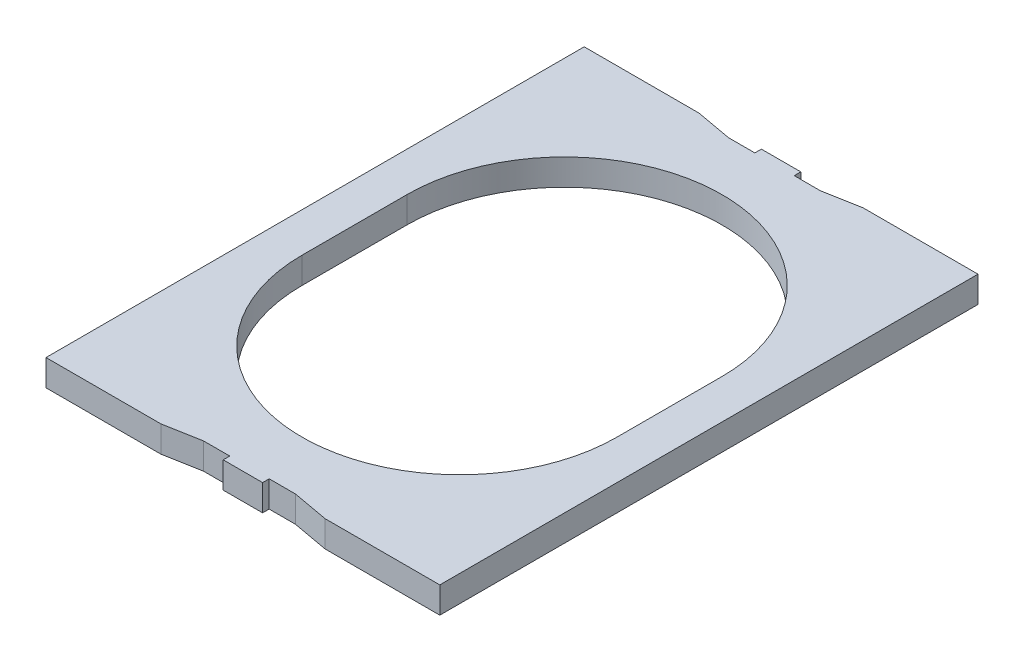
ISO-10303-21;
HEADER;
FILE_DESCRIPTION(('STEP AP214'),'2;1');
FILE_NAME('part.step','',(''),(''),'','','');
FILE_SCHEMA(('AUTOMOTIVE_DESIGN { 1 0 10303 214 1 1 1 1 }'));
ENDSEC;
DATA;
#1=APPLICATION_CONTEXT('core data for automotive mechanical design processes');
#2=APPLICATION_PROTOCOL_DEFINITION('international standard','automotive_design',2000,#1);
#3=PRODUCT_CONTEXT('',#1,'mechanical');
#4=PRODUCT('Part','Part','',(#3));
#5=PRODUCT_RELATED_PRODUCT_CATEGORY('part','',(#4));
#6=PRODUCT_DEFINITION_FORMATION('','',#4);
#7=PRODUCT_DEFINITION_CONTEXT('part definition',#1,'design');
#8=PRODUCT_DEFINITION('design','',#6,#7);
#9=PRODUCT_DEFINITION_SHAPE('','',#8);
#10=(LENGTH_UNIT() NAMED_UNIT(*) SI_UNIT(.MILLI.,.METRE.));
#11=(NAMED_UNIT(*) PLANE_ANGLE_UNIT() SI_UNIT($,.RADIAN.));
#12=(NAMED_UNIT(*) SI_UNIT($,.STERADIAN.) SOLID_ANGLE_UNIT());
#13=UNCERTAINTY_MEASURE_WITH_UNIT(LENGTH_MEASURE(1.E-05),#10,'distance_accuracy_value','');
#14=(GEOMETRIC_REPRESENTATION_CONTEXT(3) GLOBAL_UNCERTAINTY_ASSIGNED_CONTEXT((#13)) GLOBAL_UNIT_ASSIGNED_CONTEXT((#10,
#11,#12)) REPRESENTATION_CONTEXT('',''));
#15=CARTESIAN_POINT('',(0.,0.,0.));
#16=DIRECTION('',(0.,0.,1.));
#17=DIRECTION('',(1.,0.,0.));
#18=AXIS2_PLACEMENT_3D('',#15,#16,#17);
#19=CARTESIAN_POINT('',(0.,0.2,-0.4));
#20=DIRECTION('',(0.,1.,0.));
#21=DIRECTION('',(0.,0.,-1.));
#22=AXIS2_PLACEMENT_3D('',#19,#20,#21);
#23=CYLINDRICAL_SURFACE('',#22,1.2);
#24=CARTESIAN_POINT('',(0.,0.,-0.4));
#25=DIRECTION('',(0.,-1.,0.));
#26=DIRECTION('',(-1.,0.,0.));
#27=AXIS2_PLACEMENT_3D('',#24,#25,#26);
#28=CIRCLE('',#27,1.2);
#29=CARTESIAN_POINT('',(-1.2,0.,-0.4));
#30=VERTEX_POINT('',#29);
#31=CARTESIAN_POINT('',(1.2,0.,-0.4));
#32=VERTEX_POINT('',#31);
#33=EDGE_CURVE('E365',#30,#32,#28,.T.);
#34=ORIENTED_EDGE('',*,*,#33,.T.);
#35=DIRECTION('',(0.,-1.,0.));
#36=VECTOR('',#35,1.);
#37=CARTESIAN_POINT('',(1.2,0.2,-0.4));
#38=LINE('',#37,#36);
#39=CARTESIAN_POINT('',(1.2,0.2,-0.4));
#40=VERTEX_POINT('',#39);
#41=EDGE_CURVE('E299',#40,#32,#38,.T.);
#42=ORIENTED_EDGE('',*,*,#41,.F.);
#43=CARTESIAN_POINT('',(0.,0.2,-0.4));
#44=DIRECTION('',(0.,-1.,0.));
#45=DIRECTION('',(-1.,0.,0.));
#46=AXIS2_PLACEMENT_3D('',#43,#44,#45);
#47=CIRCLE('',#46,1.2);
#48=CARTESIAN_POINT('',(-1.2,0.2,-0.4));
#49=VERTEX_POINT('',#48);
#50=EDGE_CURVE('E358',#49,#40,#47,.T.);
#51=ORIENTED_EDGE('',*,*,#50,.F.);
#52=DIRECTION('',(0.,-1.,0.));
#53=VECTOR('',#52,1.);
#54=CARTESIAN_POINT('',(-1.2,0.2,-0.4));
#55=LINE('',#54,#53);
#56=EDGE_CURVE('E11',#49,#30,#55,.T.);
#57=ORIENTED_EDGE('',*,*,#56,.T.);
#58=EDGE_LOOP('',(#34,#42,#51,#57));
#59=FACE_BOUND('',#58,.T.);
#60=ADVANCED_FACE('F16',(#59),#23,.F.);
#61=CARTESIAN_POINT('',(-1.2,0.2,0.4));
#62=DIRECTION('',(-1.,0.,0.));
#63=DIRECTION('',(0.,0.,1.));
#64=AXIS2_PLACEMENT_3D('',#61,#62,#63);
#65=PLANE('',#64);
#66=DIRECTION('',(0.,0.,-1.));
#67=VECTOR('',#66,1.);
#68=CARTESIAN_POINT('',(-1.2,0.,0.4));
#69=LINE('',#68,#67);
#70=CARTESIAN_POINT('',(-1.2,0.,0.4));
#71=VERTEX_POINT('',#70);
#72=EDGE_CURVE('E362',#71,#30,#69,.T.);
#73=ORIENTED_EDGE('',*,*,#72,.T.);
#74=ORIENTED_EDGE('',*,*,#56,.F.);
#75=DIRECTION('',(0.,0.,-1.));
#76=VECTOR('',#75,1.);
#77=CARTESIAN_POINT('',(-1.2,0.2,0.4));
#78=LINE('',#77,#76);
#79=CARTESIAN_POINT('',(-1.2,0.2,0.4));
#80=VERTEX_POINT('',#79);
#81=EDGE_CURVE('E290',#80,#49,#78,.T.);
#82=ORIENTED_EDGE('',*,*,#81,.F.);
#83=DIRECTION('',(0.,-1.,0.));
#84=VECTOR('',#83,1.);
#85=CARTESIAN_POINT('',(-1.2,0.2,0.4));
#86=LINE('',#85,#84);
#87=EDGE_CURVE('E296',#80,#71,#86,.T.);
#88=ORIENTED_EDGE('',*,*,#87,.T.);
#89=EDGE_LOOP('',(#73,#74,#82,#88));
#90=FACE_BOUND('',#89,.T.);
#91=ADVANCED_FACE('F592',(#90),#65,.F.);
#92=CARTESIAN_POINT('',(1.5,0.2,2.05));
#93=DIRECTION('',(-1.,0.,0.));
#94=DIRECTION('',(0.,0.,1.));
#95=AXIS2_PLACEMENT_3D('',#92,#93,#94);
#96=PLANE('',#95);
#97=DIRECTION('',(0.,0.,-1.));
#98=VECTOR('',#97,1.);
#99=CARTESIAN_POINT('',(1.5,0.,2.05));
#100=LINE('',#99,#98);
#101=CARTESIAN_POINT('',(1.5,0.,2.05));
#102=VERTEX_POINT('',#101);
#103=CARTESIAN_POINT('',(1.5,0.,-2.05));
#104=VERTEX_POINT('',#103);
#105=EDGE_CURVE('E372',#102,#104,#100,.T.);
#106=ORIENTED_EDGE('',*,*,#105,.T.);
#107=DIRECTION('',(0.,-1.,0.));
#108=VECTOR('',#107,1.);
#109=CARTESIAN_POINT('',(1.5,0.2,-2.05));
#110=LINE('',#109,#108);
#111=CARTESIAN_POINT('',(1.5,0.2,-2.05));
#112=VERTEX_POINT('',#111);
#113=EDGE_CURVE('E27',#112,#104,#110,.T.);
#114=ORIENTED_EDGE('',*,*,#113,.F.);
#115=DIRECTION('',(0.,0.,-1.));
#116=VECTOR('',#115,1.);
#117=CARTESIAN_POINT('',(1.5,0.2,2.05));
#118=LINE('',#117,#116);
#119=CARTESIAN_POINT('',(1.5,0.2,2.05));
#120=VERTEX_POINT('',#119);
#121=EDGE_CURVE('E285',#120,#112,#118,.T.);
#122=ORIENTED_EDGE('',*,*,#121,.F.);
#123=DIRECTION('',(0.,-1.,0.));
#124=VECTOR('',#123,1.);
#125=CARTESIAN_POINT('',(1.5,0.2,2.05));
#126=LINE('',#125,#124);
#127=EDGE_CURVE('E20',#120,#102,#126,.T.);
#128=ORIENTED_EDGE('',*,*,#127,.T.);
#129=EDGE_LOOP('',(#106,#114,#122,#128));
#130=FACE_BOUND('',#129,.T.);
#131=ADVANCED_FACE('F550',(#130),#96,.F.);
#132=CARTESIAN_POINT('',(1.5,0.2,-2.05));
#133=DIRECTION('',(0.,0.,1.));
#134=DIRECTION('',(1.,0.,0.));
#135=AXIS2_PLACEMENT_3D('',#132,#133,#134);
#136=PLANE('',#135);
#137=DIRECTION('',(-1.,0.,0.));
#138=VECTOR('',#137,1.);
#139=CARTESIAN_POINT('',(1.5,0.,-2.05));
#140=LINE('',#139,#138);
#141=CARTESIAN_POINT('',(0.625,0.,-2.05));
#142=VERTEX_POINT('',#141);
#143=EDGE_CURVE('E313',#104,#142,#140,.T.);
#144=ORIENTED_EDGE('',*,*,#143,.T.);
#145=DIRECTION('',(0.,-1.,0.));
#146=VECTOR('',#145,1.);
#147=CARTESIAN_POINT('',(0.625,0.2,-2.05));
#148=LINE('',#147,#146);
#149=CARTESIAN_POINT('',(0.625,0.2,-2.05));
#150=VERTEX_POINT('',#149);
#151=EDGE_CURVE('E396',#150,#142,#148,.T.);
#152=ORIENTED_EDGE('',*,*,#151,.F.);
#153=DIRECTION('',(-1.,0.,0.));
#154=VECTOR('',#153,1.);
#155=CARTESIAN_POINT('',(1.5,0.2,-2.05));
#156=LINE('',#155,#154);
#157=EDGE_CURVE('E280',#112,#150,#156,.T.);
#158=ORIENTED_EDGE('',*,*,#157,.F.);
#159=ORIENTED_EDGE('',*,*,#113,.T.);
#160=EDGE_LOOP('',(#144,#152,#158,#159));
#161=FACE_BOUND('',#160,.T.);
#162=ADVANCED_FACE('F18',(#161),#136,.F.);
#163=CARTESIAN_POINT('',(0.35,0.2,-2.));
#164=DIRECTION('',(0.178885438199981,0.,0.983869910099908));
#165=DIRECTION('',(0.,-1.,0.));
#166=AXIS2_PLACEMENT_3D('',#163,#164,#165);
#167=PLANE('',#166);
#168=DIRECTION('',(-0.983869910099908,0.,0.178885438199981));
#169=VECTOR('',#168,1.);
#170=CARTESIAN_POINT('',(0.35,0.,-2.));
#171=LINE('',#170,#169);
#172=CARTESIAN_POINT('',(0.35,0.,-2.));
#173=VERTEX_POINT('',#172);
#174=EDGE_CURVE('E310',#142,#173,#171,.T.);
#175=ORIENTED_EDGE('',*,*,#174,.T.);
#176=DIRECTION('',(0.,-1.,0.));
#177=VECTOR('',#176,1.);
#178=CARTESIAN_POINT('',(0.35,0.2,-2.));
#179=LINE('',#178,#177);
#180=CARTESIAN_POINT('',(0.35,0.2,-2.));
#181=VERTEX_POINT('',#180);
#182=EDGE_CURVE('E142',#181,#173,#179,.T.);
#183=ORIENTED_EDGE('',*,*,#182,.F.);
#184=DIRECTION('',(-0.983869910099908,0.,0.178885438199981));
#185=VECTOR('',#184,1.);
#186=CARTESIAN_POINT('',(0.35,0.2,-2.));
#187=LINE('',#186,#185);
#188=EDGE_CURVE('E284',#150,#181,#187,.T.);
#189=ORIENTED_EDGE('',*,*,#188,.F.);
#190=ORIENTED_EDGE('',*,*,#151,.T.);
#191=EDGE_LOOP('',(#175,#183,#189,#190));
#192=FACE_BOUND('',#191,.T.);
#193=ADVANCED_FACE('F544',(#192),#167,.F.);
#194=CARTESIAN_POINT('',(0.149999999999998,0.2,-2.));
#195=DIRECTION('',(0.,0.,1.));
#196=DIRECTION('',(1.,0.,0.));
#197=AXIS2_PLACEMENT_3D('',#194,#195,#196);
#198=PLANE('',#197);
#199=DIRECTION('',(-1.,0.,0.));
#200=VECTOR('',#199,1.);
#201=CARTESIAN_POINT('',(0.149999999999998,0.,-2.));
#202=LINE('',#201,#200);
#203=CARTESIAN_POINT('',(0.149999999999998,0.,-2.));
#204=VERTEX_POINT('',#203);
#205=EDGE_CURVE('E303',#173,#204,#202,.T.);
#206=ORIENTED_EDGE('',*,*,#205,.T.);
#207=DIRECTION('',(0.,-1.,0.));
#208=VECTOR('',#207,1.);
#209=CARTESIAN_POINT('',(0.149999999999998,0.2,-2.));
#210=LINE('',#209,#208);
#211=CARTESIAN_POINT('',(0.149999999999998,0.2,-2.));
#212=VERTEX_POINT('',#211);
#213=EDGE_CURVE('E155',#212,#204,#210,.T.);
#214=ORIENTED_EDGE('',*,*,#213,.F.);
#215=DIRECTION('',(-1.,0.,0.));
#216=VECTOR('',#215,1.);
#217=CARTESIAN_POINT('',(0.149999999999998,0.2,-2.));
#218=LINE('',#217,#216);
#219=EDGE_CURVE('E316',#181,#212,#218,.T.);
#220=ORIENTED_EDGE('',*,*,#219,.F.);
#221=ORIENTED_EDGE('',*,*,#182,.T.);
#222=EDGE_LOOP('',(#206,#214,#220,#221));
#223=FACE_BOUND('',#222,.T.);
#224=ADVANCED_FACE('F540',(#223),#198,.F.);
#225=CARTESIAN_POINT('',(0.15,0.2,-2.05));
#226=DIRECTION('',(-1.,0.,0.));
#227=DIRECTION('',(0.,1.,0.));
#228=AXIS2_PLACEMENT_3D('',#225,#226,#227);
#229=PLANE('',#228);
#230=DIRECTION('',(0.,0.,-1.));
#231=VECTOR('',#230,1.);
#232=CARTESIAN_POINT('',(0.15,0.,-2.05));
#233=LINE('',#232,#231);
#234=CARTESIAN_POINT('',(0.15,0.,-2.05));
#235=VERTEX_POINT('',#234);
#236=EDGE_CURVE('E300',#204,#235,#233,.T.);
#237=ORIENTED_EDGE('',*,*,#236,.T.);
#238=DIRECTION('',(0.,-1.,0.));
#239=VECTOR('',#238,1.);
#240=CARTESIAN_POINT('',(0.15,0.2,-2.05));
#241=LINE('',#240,#239);
#242=CARTESIAN_POINT('',(0.15,0.2,-2.05));
#243=VERTEX_POINT('',#242);
#244=EDGE_CURVE('E348',#243,#235,#241,.T.);
#245=ORIENTED_EDGE('',*,*,#244,.F.);
#246=DIRECTION('',(0.,0.,-1.));
#247=VECTOR('',#246,1.);
#248=CARTESIAN_POINT('',(0.15,0.2,-2.05));
#249=LINE('',#248,#247);
#250=EDGE_CURVE('E443',#212,#243,#249,.T.);
#251=ORIENTED_EDGE('',*,*,#250,.F.);
#252=ORIENTED_EDGE('',*,*,#213,.T.);
#253=EDGE_LOOP('',(#237,#245,#251,#252));
#254=FACE_BOUND('',#253,.T.);
#255=ADVANCED_FACE('F525',(#254),#229,.F.);
#256=CARTESIAN_POINT('',(0.15,0.2,-2.05));
#257=DIRECTION('',(0.,0.,1.));
#258=DIRECTION('',(1.,0.,0.));
#259=AXIS2_PLACEMENT_3D('',#256,#257,#258);
#260=PLANE('',#259);
#261=DIRECTION('',(-1.,0.,0.));
#262=VECTOR('',#261,1.);
#263=CARTESIAN_POINT('',(0.15,0.,-2.05));
#264=LINE('',#263,#262);
#265=CARTESIAN_POINT('',(-0.15,0.,-2.05));
#266=VERTEX_POINT('',#265);
#267=EDGE_CURVE('E304',#235,#266,#264,.T.);
#268=ORIENTED_EDGE('',*,*,#267,.T.);
#269=DIRECTION('',(0.,-1.,0.));
#270=VECTOR('',#269,1.);
#271=CARTESIAN_POINT('',(-0.15,0.2,-2.05));
#272=LINE('',#271,#270);
#273=CARTESIAN_POINT('',(-0.15,0.2,-2.05));
#274=VERTEX_POINT('',#273);
#275=EDGE_CURVE('E395',#274,#266,#272,.T.);
#276=ORIENTED_EDGE('',*,*,#275,.F.);
#277=DIRECTION('',(-1.,0.,0.));
#278=VECTOR('',#277,1.);
#279=CARTESIAN_POINT('',(0.15,0.2,-2.05));
#280=LINE('',#279,#278);
#281=EDGE_CURVE('E427',#243,#274,#280,.T.);
#282=ORIENTED_EDGE('',*,*,#281,.F.);
#283=ORIENTED_EDGE('',*,*,#244,.T.);
#284=EDGE_LOOP('',(#268,#276,#282,#283));
#285=FACE_BOUND('',#284,.T.);
#286=ADVANCED_FACE('F520',(#285),#260,.F.);
#287=CARTESIAN_POINT('',(-0.15,0.2,-2.05));
#288=DIRECTION('',(1.,0.,0.));
#289=DIRECTION('',(0.,0.,-1.));
#290=AXIS2_PLACEMENT_3D('',#287,#288,#289);
#291=PLANE('',#290);
#292=DIRECTION('',(0.,0.,1.));
#293=VECTOR('',#292,1.);
#294=CARTESIAN_POINT('',(-0.15,0.,-2.05));
#295=LINE('',#294,#293);
#296=CARTESIAN_POINT('',(-0.15,0.,-2.));
#297=VERTEX_POINT('',#296);
#298=EDGE_CURVE('E305',#266,#297,#295,.T.);
#299=ORIENTED_EDGE('',*,*,#298,.T.);
#300=DIRECTION('',(0.,-1.,0.));
#301=VECTOR('',#300,1.);
#302=CARTESIAN_POINT('',(-0.15,0.2,-2.));
#303=LINE('',#302,#301);
#304=CARTESIAN_POINT('',(-0.15,0.2,-2.));
#305=VERTEX_POINT('',#304);
#306=EDGE_CURVE('E382',#305,#297,#303,.T.);
#307=ORIENTED_EDGE('',*,*,#306,.F.);
#308=DIRECTION('',(0.,0.,1.));
#309=VECTOR('',#308,1.);
#310=CARTESIAN_POINT('',(-0.15,0.2,-2.05));
#311=LINE('',#310,#309);
#312=EDGE_CURVE('E269',#274,#305,#311,.T.);
#313=ORIENTED_EDGE('',*,*,#312,.F.);
#314=ORIENTED_EDGE('',*,*,#275,.T.);
#315=EDGE_LOOP('',(#299,#307,#313,#314));
#316=FACE_BOUND('',#315,.T.);
#317=ADVANCED_FACE('F530',(#316),#291,.F.);
#318=CARTESIAN_POINT('',(-0.149999999999998,0.2,-2.));
#319=DIRECTION('',(0.,0.,1.));
#320=DIRECTION('',(1.,0.,0.));
#321=AXIS2_PLACEMENT_3D('',#318,#319,#320);
#322=PLANE('',#321);
#323=DIRECTION('',(-1.,0.,0.));
#324=VECTOR('',#323,1.);
#325=CARTESIAN_POINT('',(-0.149999999999998,0.,-2.));
#326=LINE('',#325,#324);
#327=CARTESIAN_POINT('',(-0.35,0.,-2.));
#328=VERTEX_POINT('',#327);
#329=EDGE_CURVE('E309',#297,#328,#326,.T.);
#330=ORIENTED_EDGE('',*,*,#329,.T.);
#331=DIRECTION('',(0.,-1.,0.));
#332=VECTOR('',#331,1.);
#333=CARTESIAN_POINT('',(-0.35,0.2,-2.));
#334=LINE('',#333,#332);
#335=CARTESIAN_POINT('',(-0.35,0.2,-2.));
#336=VERTEX_POINT('',#335);
#337=EDGE_CURVE('E379',#336,#328,#334,.T.);
#338=ORIENTED_EDGE('',*,*,#337,.F.);
#339=DIRECTION('',(-1.,0.,0.));
#340=VECTOR('',#339,1.);
#341=CARTESIAN_POINT('',(-0.149999999999998,0.2,-2.));
#342=LINE('',#341,#340);
#343=EDGE_CURVE('E386',#305,#336,#342,.T.);
#344=ORIENTED_EDGE('',*,*,#343,.F.);
#345=ORIENTED_EDGE('',*,*,#306,.T.);
#346=EDGE_LOOP('',(#330,#338,#344,#345));
#347=FACE_BOUND('',#346,.T.);
#348=ADVANCED_FACE('F616',(#347),#322,.F.);
#349=CARTESIAN_POINT('',(-0.35,0.2,-2.));
#350=DIRECTION('',(-0.178885438199981,0.,0.983869910099908));
#351=DIRECTION('',(0.,1.,0.));
#352=AXIS2_PLACEMENT_3D('',#349,#350,#351);
#353=PLANE('',#352);
#354=DIRECTION('',(-0.983869910099908,0.,-0.178885438199981));
#355=VECTOR('',#354,1.);
#356=CARTESIAN_POINT('',(-0.35,0.,-2.));
#357=LINE('',#356,#355);
#358=CARTESIAN_POINT('',(-0.625,0.,-2.05));
#359=VERTEX_POINT('',#358);
#360=EDGE_CURVE('E452',#328,#359,#357,.T.);
#361=ORIENTED_EDGE('',*,*,#360,.T.);
#362=DIRECTION('',(0.,-1.,0.));
#363=VECTOR('',#362,1.);
#364=CARTESIAN_POINT('',(-0.625,0.2,-2.05));
#365=LINE('',#364,#363);
#366=CARTESIAN_POINT('',(-0.625,0.2,-2.05));
#367=VERTEX_POINT('',#366);
#368=EDGE_CURVE('E383',#367,#359,#365,.T.);
#369=ORIENTED_EDGE('',*,*,#368,.F.);
#370=DIRECTION('',(-0.983869910099908,0.,-0.178885438199981));
#371=VECTOR('',#370,1.);
#372=CARTESIAN_POINT('',(-0.35,0.2,-2.));
#373=LINE('',#372,#371);
#374=EDGE_CURVE('E275',#336,#367,#373,.T.);
#375=ORIENTED_EDGE('',*,*,#374,.F.);
#376=ORIENTED_EDGE('',*,*,#337,.T.);
#377=EDGE_LOOP('',(#361,#369,#375,#376));
#378=FACE_BOUND('',#377,.T.);
#379=ADVANCED_FACE('F588',(#378),#353,.F.);
#380=CARTESIAN_POINT('',(-0.625,0.2,-2.05));
#381=DIRECTION('',(0.,0.,1.));
#382=DIRECTION('',(1.,0.,0.));
#383=AXIS2_PLACEMENT_3D('',#380,#381,#382);
#384=PLANE('',#383);
#385=DIRECTION('',(-1.,0.,0.));
#386=VECTOR('',#385,1.);
#387=CARTESIAN_POINT('',(-0.625,0.,-2.05));
#388=LINE('',#387,#386);
#389=CARTESIAN_POINT('',(-1.5,0.,-2.05));
#390=VERTEX_POINT('',#389);
#391=EDGE_CURVE('E449',#359,#390,#388,.T.);
#392=ORIENTED_EDGE('',*,*,#391,.T.);
#393=DIRECTION('',(0.,-1.,0.));
#394=VECTOR('',#393,1.);
#395=CARTESIAN_POINT('',(-1.5,0.2,-2.05));
#396=LINE('',#395,#394);
#397=CARTESIAN_POINT('',(-1.5,0.2,-2.05));
#398=VERTEX_POINT('',#397);
#399=EDGE_CURVE('E406',#398,#390,#396,.T.);
#400=ORIENTED_EDGE('',*,*,#399,.F.);
#401=DIRECTION('',(-1.,0.,0.));
#402=VECTOR('',#401,1.);
#403=CARTESIAN_POINT('',(-0.625,0.2,-2.05));
#404=LINE('',#403,#402);
#405=EDGE_CURVE('E271',#367,#398,#404,.T.);
#406=ORIENTED_EDGE('',*,*,#405,.F.);
#407=ORIENTED_EDGE('',*,*,#368,.T.);
#408=EDGE_LOOP('',(#392,#400,#406,#407));
#409=FACE_BOUND('',#408,.T.);
#410=ADVANCED_FACE('F580',(#409),#384,.F.);
#411=CARTESIAN_POINT('',(-1.5,0.2,-2.05));
#412=DIRECTION('',(1.,0.,0.));
#413=DIRECTION('',(0.,0.,1.));
#414=AXIS2_PLACEMENT_3D('',#411,#412,#413);
#415=PLANE('',#414);
#416=DIRECTION('',(0.,0.,1.));
#417=VECTOR('',#416,1.);
#418=CARTESIAN_POINT('',(-1.5,0.,-2.05));
#419=LINE('',#418,#417);
#420=CARTESIAN_POINT('',(-1.5,0.,2.05));
#421=VERTEX_POINT('',#420);
#422=EDGE_CURVE('E446',#390,#421,#419,.T.);
#423=ORIENTED_EDGE('',*,*,#422,.T.);
#424=DIRECTION('',(0.,-1.,0.));
#425=VECTOR('',#424,1.);
#426=CARTESIAN_POINT('',(-1.5,0.2,2.05));
#427=LINE('',#426,#425);
#428=CARTESIAN_POINT('',(-1.5,0.2,2.05));
#429=VERTEX_POINT('',#428);
#430=EDGE_CURVE('E413',#429,#421,#427,.T.);
#431=ORIENTED_EDGE('',*,*,#430,.F.);
#432=DIRECTION('',(0.,0.,1.));
#433=VECTOR('',#432,1.);
#434=CARTESIAN_POINT('',(-1.5,0.2,-2.05));
#435=LINE('',#434,#433);
#436=EDGE_CURVE('E274',#398,#429,#435,.T.);
#437=ORIENTED_EDGE('',*,*,#436,.F.);
#438=ORIENTED_EDGE('',*,*,#399,.T.);
#439=EDGE_LOOP('',(#423,#431,#437,#438));
#440=FACE_BOUND('',#439,.T.);
#441=ADVANCED_FACE('F578',(#440),#415,.F.);
#442=CARTESIAN_POINT('',(-1.5,0.2,2.05));
#443=DIRECTION('',(0.,0.,-1.));
#444=DIRECTION('',(0.,-1.,0.));
#445=AXIS2_PLACEMENT_3D('',#442,#443,#444);
#446=PLANE('',#445);
#447=DIRECTION('',(1.,0.,0.));
#448=VECTOR('',#447,1.);
#449=CARTESIAN_POINT('',(-1.5,0.,2.05));
#450=LINE('',#449,#448);
#451=CARTESIAN_POINT('',(-0.625,0.,2.05));
#452=VERTEX_POINT('',#451);
#453=EDGE_CURVE('E337',#421,#452,#450,.T.);
#454=ORIENTED_EDGE('',*,*,#453,.T.);
#455=DIRECTION('',(0.,-1.,0.));
#456=VECTOR('',#455,1.);
#457=CARTESIAN_POINT('',(-0.625,0.2,2.05));
#458=LINE('',#457,#456);
#459=CARTESIAN_POINT('',(-0.625,0.2,2.05));
#460=VERTEX_POINT('',#459);
#461=EDGE_CURVE('E423',#460,#452,#458,.T.);
#462=ORIENTED_EDGE('',*,*,#461,.F.);
#463=DIRECTION('',(1.,0.,0.));
#464=VECTOR('',#463,1.);
#465=CARTESIAN_POINT('',(-1.5,0.2,2.05));
#466=LINE('',#465,#464);
#467=EDGE_CURVE('E278',#429,#460,#466,.T.);
#468=ORIENTED_EDGE('',*,*,#467,.F.);
#469=ORIENTED_EDGE('',*,*,#430,.T.);
#470=EDGE_LOOP('',(#454,#462,#468,#469));
#471=FACE_BOUND('',#470,.T.);
#472=ADVANCED_FACE('F577',(#471),#446,.F.);
#473=CARTESIAN_POINT('',(-0.35,0.2,2.));
#474=DIRECTION('',(-0.178885438199981,0.,-0.983869910099908));
#475=DIRECTION('',(-0.983869910099908,0.,0.178885438199981));
#476=AXIS2_PLACEMENT_3D('',#473,#474,#475);
#477=PLANE('',#476);
#478=DIRECTION('',(0.983869910099908,0.,-0.178885438199981));
#479=VECTOR('',#478,1.);
#480=CARTESIAN_POINT('',(-0.35,0.,2.));
#481=LINE('',#480,#479);
#482=CARTESIAN_POINT('',(-0.35,0.,2.));
#483=VERTEX_POINT('',#482);
#484=EDGE_CURVE('E480',#452,#483,#481,.T.);
#485=ORIENTED_EDGE('',*,*,#484,.T.);
#486=DIRECTION('',(0.,-1.,0.));
#487=VECTOR('',#486,1.);
#488=CARTESIAN_POINT('',(-0.35,0.2,2.));
#489=LINE('',#488,#487);
#490=CARTESIAN_POINT('',(-0.35,0.2,2.));
#491=VERTEX_POINT('',#490);
#492=EDGE_CURVE('E352',#491,#483,#489,.T.);
#493=ORIENTED_EDGE('',*,*,#492,.F.);
#494=DIRECTION('',(0.983869910099908,0.,-0.178885438199981));
#495=VECTOR('',#494,1.);
#496=CARTESIAN_POINT('',(-0.35,0.2,2.));
#497=LINE('',#496,#495);
#498=EDGE_CURVE('E319',#460,#491,#497,.T.);
#499=ORIENTED_EDGE('',*,*,#498,.F.);
#500=ORIENTED_EDGE('',*,*,#461,.T.);
#501=EDGE_LOOP('',(#485,#493,#499,#500));
#502=FACE_BOUND('',#501,.T.);
#503=ADVANCED_FACE('F570',(#502),#477,.F.);
#504=CARTESIAN_POINT('',(-0.149999999999998,0.2,2.));
#505=DIRECTION('',(0.,0.,-1.));
#506=DIRECTION('',(0.,-1.,0.));
#507=AXIS2_PLACEMENT_3D('',#504,#505,#506);
#508=PLANE('',#507);
#509=DIRECTION('',(1.,0.,0.));
#510=VECTOR('',#509,1.);
#511=CARTESIAN_POINT('',(-0.149999999999998,0.,2.));
#512=LINE('',#511,#510);
#513=CARTESIAN_POINT('',(-0.149999999999998,0.,2.));
#514=VERTEX_POINT('',#513);
#515=EDGE_CURVE('E436',#483,#514,#512,.T.);
#516=ORIENTED_EDGE('',*,*,#515,.T.);
#517=DIRECTION('',(0.,-1.,0.));
#518=VECTOR('',#517,1.);
#519=CARTESIAN_POINT('',(-0.149999999999998,0.2,2.));
#520=LINE('',#519,#518);
#521=CARTESIAN_POINT('',(-0.149999999999998,0.2,2.));
#522=VERTEX_POINT('',#521);
#523=EDGE_CURVE('E349',#522,#514,#520,.T.);
#524=ORIENTED_EDGE('',*,*,#523,.F.);
#525=DIRECTION('',(1.,0.,0.));
#526=VECTOR('',#525,1.);
#527=CARTESIAN_POINT('',(-0.149999999999998,0.2,2.));
#528=LINE('',#527,#526);
#529=EDGE_CURVE('E326',#491,#522,#528,.T.);
#530=ORIENTED_EDGE('',*,*,#529,.F.);
#531=ORIENTED_EDGE('',*,*,#492,.T.);
#532=EDGE_LOOP('',(#516,#524,#530,#531));
#533=FACE_BOUND('',#532,.T.);
#534=ADVANCED_FACE('F568',(#533),#508,.F.);
#535=CARTESIAN_POINT('',(-0.15,0.2,2.05));
#536=DIRECTION('',(1.,0.,0.));
#537=DIRECTION('',(0.,0.,1.));
#538=AXIS2_PLACEMENT_3D('',#535,#536,#537);
#539=PLANE('',#538);
#540=DIRECTION('',(0.,0.,1.));
#541=VECTOR('',#540,1.);
#542=CARTESIAN_POINT('',(-0.15,0.,2.05));
#543=LINE('',#542,#541);
#544=CARTESIAN_POINT('',(-0.15,0.,2.05));
#545=VERTEX_POINT('',#544);
#546=EDGE_CURVE('E378',#514,#545,#543,.T.);
#547=ORIENTED_EDGE('',*,*,#546,.T.);
#548=DIRECTION('',(0.,-1.,0.));
#549=VECTOR('',#548,1.);
#550=CARTESIAN_POINT('',(-0.15,0.2,2.05));
#551=LINE('',#550,#549);
#552=CARTESIAN_POINT('',(-0.15,0.2,2.05));
#553=VERTEX_POINT('',#552);
#554=EDGE_CURVE('E353',#553,#545,#551,.T.);
#555=ORIENTED_EDGE('',*,*,#554,.F.);
#556=DIRECTION('',(0.,0.,1.));
#557=VECTOR('',#556,1.);
#558=CARTESIAN_POINT('',(-0.15,0.2,2.05));
#559=LINE('',#558,#557);
#560=EDGE_CURVE('E334',#522,#553,#559,.T.);
#561=ORIENTED_EDGE('',*,*,#560,.F.);
#562=ORIENTED_EDGE('',*,*,#523,.T.);
#563=EDGE_LOOP('',(#547,#555,#561,#562));
#564=FACE_BOUND('',#563,.T.);
#565=ADVANCED_FACE('F565',(#564),#539,.F.);
#566=CARTESIAN_POINT('',(-0.15,0.2,2.05));
#567=DIRECTION('',(0.,0.,-1.));
#568=DIRECTION('',(0.,-1.,0.));
#569=AXIS2_PLACEMENT_3D('',#566,#567,#568);
#570=PLANE('',#569);
#571=DIRECTION('',(1.,0.,0.));
#572=VECTOR('',#571,1.);
#573=CARTESIAN_POINT('',(-0.15,0.,2.05));
#574=LINE('',#573,#572);
#575=CARTESIAN_POINT('',(0.15,0.,2.05));
#576=VERTEX_POINT('',#575);
#577=EDGE_CURVE('E252',#545,#576,#574,.T.);
#578=ORIENTED_EDGE('',*,*,#577,.T.);
#579=DIRECTION('',(0.,-1.,0.));
#580=VECTOR('',#579,1.);
#581=CARTESIAN_POINT('',(0.15,0.2,2.05));
#582=LINE('',#581,#580);
#583=CARTESIAN_POINT('',(0.15,0.2,2.05));
#584=VERTEX_POINT('',#583);
#585=EDGE_CURVE('E242',#584,#576,#582,.T.);
#586=ORIENTED_EDGE('',*,*,#585,.F.);
#587=DIRECTION('',(1.,0.,0.));
#588=VECTOR('',#587,1.);
#589=CARTESIAN_POINT('',(-0.15,0.2,2.05));
#590=LINE('',#589,#588);
#591=EDGE_CURVE('E361',#553,#584,#590,.T.);
#592=ORIENTED_EDGE('',*,*,#591,.F.);
#593=ORIENTED_EDGE('',*,*,#554,.T.);
#594=EDGE_LOOP('',(#578,#586,#592,#593));
#595=FACE_BOUND('',#594,.T.);
#596=ADVANCED_FACE('F560',(#595),#570,.F.);
#597=CARTESIAN_POINT('',(0.15,0.2,2.05));
#598=DIRECTION('',(-1.,0.,0.));
#599=DIRECTION('',(0.,0.,1.));
#600=AXIS2_PLACEMENT_3D('',#597,#598,#599);
#601=PLANE('',#600);
#602=DIRECTION('',(0.,0.,-1.));
#603=VECTOR('',#602,1.);
#604=CARTESIAN_POINT('',(0.15,0.,2.05));
#605=LINE('',#604,#603);
#606=CARTESIAN_POINT('',(0.15,0.,2.));
#607=VERTEX_POINT('',#606);
#608=EDGE_CURVE('E246',#576,#607,#605,.T.);
#609=ORIENTED_EDGE('',*,*,#608,.T.);
#610=DIRECTION('',(0.,-1.,0.));
#611=VECTOR('',#610,1.);
#612=CARTESIAN_POINT('',(0.15,0.2,2.));
#613=LINE('',#612,#611);
#614=CARTESIAN_POINT('',(0.15,0.2,2.));
#615=VERTEX_POINT('',#614);
#616=EDGE_CURVE('E230',#615,#607,#613,.T.);
#617=ORIENTED_EDGE('',*,*,#616,.F.);
#618=DIRECTION('',(0.,0.,-1.));
#619=VECTOR('',#618,1.);
#620=CARTESIAN_POINT('',(0.15,0.2,2.05));
#621=LINE('',#620,#619);
#622=EDGE_CURVE('E295',#584,#615,#621,.T.);
#623=ORIENTED_EDGE('',*,*,#622,.F.);
#624=ORIENTED_EDGE('',*,*,#585,.T.);
#625=EDGE_LOOP('',(#609,#617,#623,#624));
#626=FACE_BOUND('',#625,.T.);
#627=ADVANCED_FACE('F247',(#626),#601,.F.);
#628=CARTESIAN_POINT('',(0.149999999999998,0.2,2.));
#629=DIRECTION('',(0.,0.,-1.));
#630=DIRECTION('',(-1.,0.,0.));
#631=AXIS2_PLACEMENT_3D('',#628,#629,#630);
#632=PLANE('',#631);
#633=DIRECTION('',(1.,0.,0.));
#634=VECTOR('',#633,1.);
#635=CARTESIAN_POINT('',(0.149999999999998,0.,2.));
#636=LINE('',#635,#634);
#637=CARTESIAN_POINT('',(0.35,0.,2.));
#638=VERTEX_POINT('',#637);
#639=EDGE_CURVE('E234',#607,#638,#636,.T.);
#640=ORIENTED_EDGE('',*,*,#639,.T.);
#641=DIRECTION('',(0.,-1.,0.));
#642=VECTOR('',#641,1.);
#643=CARTESIAN_POINT('',(0.35,0.2,2.));
#644=LINE('',#643,#642);
#645=CARTESIAN_POINT('',(0.35,0.2,2.));
#646=VERTEX_POINT('',#645);
#647=EDGE_CURVE('E243',#646,#638,#644,.T.);
#648=ORIENTED_EDGE('',*,*,#647,.F.);
#649=DIRECTION('',(1.,0.,0.));
#650=VECTOR('',#649,1.);
#651=CARTESIAN_POINT('',(0.149999999999998,0.2,2.));
#652=LINE('',#651,#650);
#653=EDGE_CURVE('E237',#615,#646,#652,.T.);
#654=ORIENTED_EDGE('',*,*,#653,.F.);
#655=ORIENTED_EDGE('',*,*,#616,.T.);
#656=EDGE_LOOP('',(#640,#648,#654,#655));
#657=FACE_BOUND('',#656,.T.);
#658=ADVANCED_FACE('F232',(#657),#632,.F.);
#659=CARTESIAN_POINT('',(0.35,0.2,2.));
#660=DIRECTION('',(0.178885438199981,0.,-0.983869910099908));
#661=DIRECTION('',(0.,-1.,0.));
#662=AXIS2_PLACEMENT_3D('',#659,#660,#661);
#663=PLANE('',#662);
#664=DIRECTION('',(0.983869910099908,0.,0.178885438199981));
#665=VECTOR('',#664,1.);
#666=CARTESIAN_POINT('',(0.35,0.,2.));
#667=LINE('',#666,#665);
#668=CARTESIAN_POINT('',(0.625,0.,2.05));
#669=VERTEX_POINT('',#668);
#670=EDGE_CURVE('E258',#638,#669,#667,.T.);
#671=ORIENTED_EDGE('',*,*,#670,.T.);
#672=DIRECTION('',(0.,-1.,0.));
#673=VECTOR('',#672,1.);
#674=CARTESIAN_POINT('',(0.625,0.2,2.05));
#675=LINE('',#674,#673);
#676=CARTESIAN_POINT('',(0.625,0.2,2.05));
#677=VERTEX_POINT('',#676);
#678=EDGE_CURVE('E368',#677,#669,#675,.T.);
#679=ORIENTED_EDGE('',*,*,#678,.F.);
#680=DIRECTION('',(0.983869910099908,0.,0.178885438199981));
#681=VECTOR('',#680,1.);
#682=CARTESIAN_POINT('',(0.35,0.2,2.));
#683=LINE('',#682,#681);
#684=EDGE_CURVE('E294',#646,#677,#683,.T.);
#685=ORIENTED_EDGE('',*,*,#684,.F.);
#686=ORIENTED_EDGE('',*,*,#647,.T.);
#687=EDGE_LOOP('',(#671,#679,#685,#686));
#688=FACE_BOUND('',#687,.T.);
#689=ADVANCED_FACE('F556',(#688),#663,.F.);
#690=CARTESIAN_POINT('',(0.625,0.2,2.05));
#691=DIRECTION('',(0.,0.,-1.));
#692=DIRECTION('',(-1.,0.,0.));
#693=AXIS2_PLACEMENT_3D('',#690,#691,#692);
#694=PLANE('',#693);
#695=DIRECTION('',(1.,0.,0.));
#696=VECTOR('',#695,1.);
#697=CARTESIAN_POINT('',(0.625,0.,2.05));
#698=LINE('',#697,#696);
#699=EDGE_CURVE('E265',#669,#102,#698,.T.);
#700=ORIENTED_EDGE('',*,*,#699,.T.);
#701=ORIENTED_EDGE('',*,*,#127,.F.);
#702=DIRECTION('',(1.,0.,0.));
#703=VECTOR('',#702,1.);
#704=CARTESIAN_POINT('',(0.625,0.2,2.05));
#705=LINE('',#704,#703);
#706=EDGE_CURVE('E458',#677,#120,#705,.T.);
#707=ORIENTED_EDGE('',*,*,#706,.F.);
#708=ORIENTED_EDGE('',*,*,#678,.T.);
#709=EDGE_LOOP('',(#700,#701,#707,#708));
#710=FACE_BOUND('',#709,.T.);
#711=ADVANCED_FACE('F552',(#710),#694,.F.);
#712=CARTESIAN_POINT('',(0.,0.2,0.4));
#713=DIRECTION('',(0.,1.,0.));
#714=DIRECTION('',(0.,0.,1.));
#715=AXIS2_PLACEMENT_3D('',#712,#713,#714);
#716=CYLINDRICAL_SURFACE('',#715,1.2);
#717=CARTESIAN_POINT('',(0.,0.,0.4));
#718=DIRECTION('',(0.,-1.,0.));
#719=DIRECTION('',(1.,0.,0.));
#720=AXIS2_PLACEMENT_3D('',#717,#718,#719);
#721=CIRCLE('',#720,1.2);
#722=CARTESIAN_POINT('',(1.2,0.,0.4));
#723=VERTEX_POINT('',#722);
#724=EDGE_CURVE('E341',#723,#71,#721,.T.);
#725=ORIENTED_EDGE('',*,*,#724,.T.);
#726=ORIENTED_EDGE('',*,*,#87,.F.);
#727=CARTESIAN_POINT('',(0.,0.2,0.4));
#728=DIRECTION('',(0.,-1.,0.));
#729=DIRECTION('',(1.,0.,0.));
#730=AXIS2_PLACEMENT_3D('',#727,#728,#729);
#731=CIRCLE('',#730,1.2);
#732=CARTESIAN_POINT('',(1.2,0.2,0.4));
#733=VERTEX_POINT('',#732);
#734=EDGE_CURVE('E286',#733,#80,#731,.T.);
#735=ORIENTED_EDGE('',*,*,#734,.F.);
#736=DIRECTION('',(0.,-1.,0.));
#737=VECTOR('',#736,1.);
#738=CARTESIAN_POINT('',(1.2,0.2,0.4));
#739=LINE('',#738,#737);
#740=EDGE_CURVE('E355',#733,#723,#739,.T.);
#741=ORIENTED_EDGE('',*,*,#740,.T.);
#742=EDGE_LOOP('',(#725,#726,#735,#741));
#743=FACE_BOUND('',#742,.T.);
#744=ADVANCED_FACE('F764',(#743),#716,.F.);
#745=CARTESIAN_POINT('',(1.2,0.2,-0.4));
#746=DIRECTION('',(1.,0.,0.));
#747=DIRECTION('',(0.,1.,0.));
#748=AXIS2_PLACEMENT_3D('',#745,#746,#747);
#749=PLANE('',#748);
#750=DIRECTION('',(0.,0.,1.));
#751=VECTOR('',#750,1.);
#752=CARTESIAN_POINT('',(1.2,0.,-0.4));
#753=LINE('',#752,#751);
#754=EDGE_CURVE('E345',#32,#723,#753,.T.);
#755=ORIENTED_EDGE('',*,*,#754,.T.);
#756=ORIENTED_EDGE('',*,*,#740,.F.);
#757=DIRECTION('',(0.,0.,1.));
#758=VECTOR('',#757,1.);
#759=CARTESIAN_POINT('',(1.2,0.2,-0.4));
#760=LINE('',#759,#758);
#761=EDGE_CURVE('E291',#40,#733,#760,.T.);
#762=ORIENTED_EDGE('',*,*,#761,.F.);
#763=ORIENTED_EDGE('',*,*,#41,.T.);
#764=EDGE_LOOP('',(#755,#756,#762,#763));
#765=FACE_BOUND('',#764,.T.);
#766=ADVANCED_FACE('F508',(#765),#749,.F.);
#767=CARTESIAN_POINT('',(0.,0.2,0.));
#768=DIRECTION('',(0.,1.,0.));
#769=DIRECTION('',(1.,0.,0.));
#770=AXIS2_PLACEMENT_3D('',#767,#768,#769);
#771=PLANE('',#770);
#772=ORIENTED_EDGE('',*,*,#761,.T.);
#773=ORIENTED_EDGE('',*,*,#734,.T.);
#774=ORIENTED_EDGE('',*,*,#81,.T.);
#775=ORIENTED_EDGE('',*,*,#50,.T.);
#776=EDGE_LOOP('',(#772,#773,#774,#775));
#777=FACE_BOUND('',#776,.T.);
#778=ORIENTED_EDGE('',*,*,#121,.T.);
#779=ORIENTED_EDGE('',*,*,#157,.T.);
#780=ORIENTED_EDGE('',*,*,#188,.T.);
#781=ORIENTED_EDGE('',*,*,#219,.T.);
#782=ORIENTED_EDGE('',*,*,#250,.T.);
#783=ORIENTED_EDGE('',*,*,#281,.T.);
#784=ORIENTED_EDGE('',*,*,#312,.T.);
#785=ORIENTED_EDGE('',*,*,#343,.T.);
#786=ORIENTED_EDGE('',*,*,#374,.T.);
#787=ORIENTED_EDGE('',*,*,#405,.T.);
#788=ORIENTED_EDGE('',*,*,#436,.T.);
#789=ORIENTED_EDGE('',*,*,#467,.T.);
#790=ORIENTED_EDGE('',*,*,#498,.T.);
#791=ORIENTED_EDGE('',*,*,#529,.T.);
#792=ORIENTED_EDGE('',*,*,#560,.T.);
#793=ORIENTED_EDGE('',*,*,#591,.T.);
#794=ORIENTED_EDGE('',*,*,#622,.T.);
#795=ORIENTED_EDGE('',*,*,#653,.T.);
#796=ORIENTED_EDGE('',*,*,#684,.T.);
#797=ORIENTED_EDGE('',*,*,#706,.T.);
#798=EDGE_LOOP('',(#778,#779,#780,#781,#782,#783,#784,#785,#786,#787,#788,#789,#790,#791,#792,
#793,#794,#795,#796,#797));
#799=FACE_BOUND('',#798,.T.);
#800=ADVANCED_FACE('F534',(#777,#799),#771,.T.);
#801=CARTESIAN_POINT('',(0.,0.,0.));
#802=DIRECTION('',(0.,1.,0.));
#803=DIRECTION('',(1.,0.,0.));
#804=AXIS2_PLACEMENT_3D('',#801,#802,#803);
#805=PLANE('',#804);
#806=ORIENTED_EDGE('',*,*,#754,.F.);
#807=ORIENTED_EDGE('',*,*,#33,.F.);
#808=ORIENTED_EDGE('',*,*,#72,.F.);
#809=ORIENTED_EDGE('',*,*,#724,.F.);
#810=EDGE_LOOP('',(#806,#807,#808,#809));
#811=FACE_BOUND('',#810,.T.);
#812=ORIENTED_EDGE('',*,*,#105,.F.);
#813=ORIENTED_EDGE('',*,*,#699,.F.);
#814=ORIENTED_EDGE('',*,*,#670,.F.);
#815=ORIENTED_EDGE('',*,*,#639,.F.);
#816=ORIENTED_EDGE('',*,*,#608,.F.);
#817=ORIENTED_EDGE('',*,*,#577,.F.);
#818=ORIENTED_EDGE('',*,*,#546,.F.);
#819=ORIENTED_EDGE('',*,*,#515,.F.);
#820=ORIENTED_EDGE('',*,*,#484,.F.);
#821=ORIENTED_EDGE('',*,*,#453,.F.);
#822=ORIENTED_EDGE('',*,*,#422,.F.);
#823=ORIENTED_EDGE('',*,*,#391,.F.);
#824=ORIENTED_EDGE('',*,*,#360,.F.);
#825=ORIENTED_EDGE('',*,*,#329,.F.);
#826=ORIENTED_EDGE('',*,*,#298,.F.);
#827=ORIENTED_EDGE('',*,*,#267,.F.);
#828=ORIENTED_EDGE('',*,*,#236,.F.);
#829=ORIENTED_EDGE('',*,*,#205,.F.);
#830=ORIENTED_EDGE('',*,*,#174,.F.);
#831=ORIENTED_EDGE('',*,*,#143,.F.);
#832=EDGE_LOOP('',(#812,#813,#814,#815,#816,#817,#818,#819,#820,#821,#822,#823,#824,#825,#826,
#827,#828,#829,#830,#831));
#833=FACE_BOUND('',#832,.T.);
#834=ADVANCED_FACE('F255',(#811,#833),#805,.F.);
#835=CLOSED_SHELL('',(#60,#91,#131,#162,#193,#224,#255,#286,#317,#348,#379,#410,#441,#472,#503,
#534,#565,#596,#627,#658,#689,#711,#744,#766,#800,#834));
#836=MANIFOLD_SOLID_BREP('B1',#835);
#837=ADVANCED_BREP_SHAPE_REPRESENTATION('',(#18,#836),#14);
#838=SHAPE_DEFINITION_REPRESENTATION(#9,#837);
ENDSEC;
END-ISO-10303-21;
